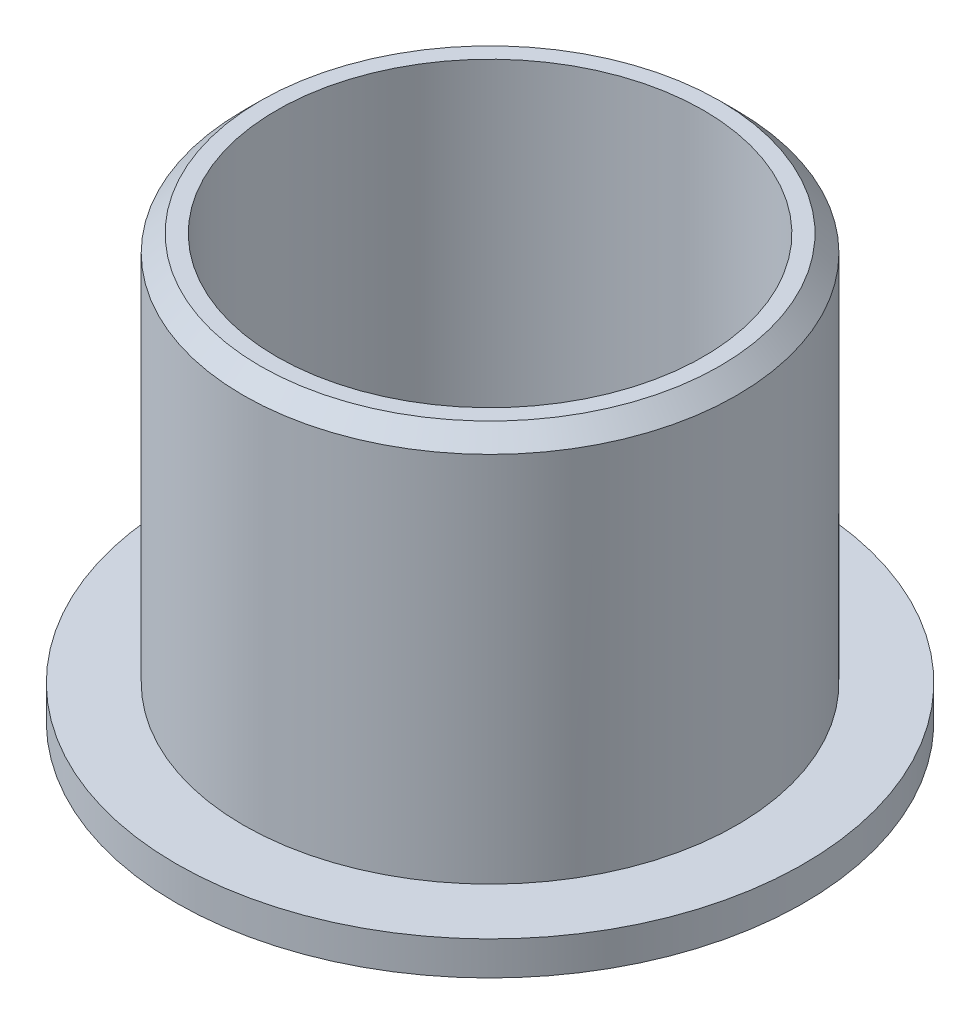
ISO-10303-21;
HEADER;
FILE_DESCRIPTION(('STEP AP214'),'2;1');
FILE_NAME('part.step','',(''),(''),'','','');
FILE_SCHEMA(('AUTOMOTIVE_DESIGN { 1 0 10303 214 1 1 1 1 }'));
ENDSEC;
DATA;
#1=APPLICATION_CONTEXT('core data for automotive mechanical design processes');
#2=APPLICATION_PROTOCOL_DEFINITION('international standard','automotive_design',2000,#1);
#3=PRODUCT_CONTEXT('',#1,'mechanical');
#4=PRODUCT('Part','Part','',(#3));
#5=PRODUCT_RELATED_PRODUCT_CATEGORY('part','',(#4));
#6=PRODUCT_DEFINITION_FORMATION('','',#4);
#7=PRODUCT_DEFINITION_CONTEXT('part definition',#1,'design');
#8=PRODUCT_DEFINITION('design','',#6,#7);
#9=PRODUCT_DEFINITION_SHAPE('','',#8);
#10=(LENGTH_UNIT() NAMED_UNIT(*) SI_UNIT(.MILLI.,.METRE.));
#11=(NAMED_UNIT(*) PLANE_ANGLE_UNIT() SI_UNIT($,.RADIAN.));
#12=(NAMED_UNIT(*) SI_UNIT($,.STERADIAN.) SOLID_ANGLE_UNIT());
#13=UNCERTAINTY_MEASURE_WITH_UNIT(LENGTH_MEASURE(1.E-05),#10,'distance_accuracy_value','');
#14=(GEOMETRIC_REPRESENTATION_CONTEXT(3) GLOBAL_UNCERTAINTY_ASSIGNED_CONTEXT((#13)) GLOBAL_UNIT_ASSIGNED_CONTEXT((#10,
#11,#12)) REPRESENTATION_CONTEXT('',''));
#15=CARTESIAN_POINT('',(0.,0.,0.));
#16=DIRECTION('',(0.,0.,1.));
#17=DIRECTION('',(1.,0.,0.));
#18=AXIS2_PLACEMENT_3D('',#15,#16,#17);
#19=CARTESIAN_POINT('',(0.,0.,0.));
#20=DIRECTION('',(0.,1.,0.));
#21=DIRECTION('',(0.,0.,1.));
#22=AXIS2_PLACEMENT_3D('',#19,#20,#21);
#23=PLANE('',#22);
#24=CARTESIAN_POINT('',(0.,0.,0.));
#25=DIRECTION('',(0.,1.,0.));
#26=DIRECTION('',(0.,0.,1.));
#27=AXIS2_PLACEMENT_3D('',#24,#25,#26);
#28=CIRCLE('',#27,9.6139);
#29=CARTESIAN_POINT('',(0.,0.,9.6139));
#30=VERTEX_POINT('',#29);
#31=EDGE_CURVE('E17',#30,#30,#28,.T.);
#32=ORIENTED_EDGE('',*,*,#31,.T.);
#33=EDGE_LOOP('',(#32));
#34=FACE_BOUND('',#33,.T.);
#35=CARTESIAN_POINT('',(0.,0.,0.));
#36=DIRECTION('',(0.,1.,0.));
#37=DIRECTION('',(0.,0.,1.));
#38=AXIS2_PLACEMENT_3D('',#35,#36,#37);
#39=CIRCLE('',#38,14.1351);
#40=CARTESIAN_POINT('',(0.,0.,14.1351));
#41=VERTEX_POINT('',#40);
#42=EDGE_CURVE('E38',#41,#41,#39,.T.);
#43=ORIENTED_EDGE('',*,*,#42,.F.);
#44=EDGE_LOOP('',(#43));
#45=FACE_BOUND('',#44,.T.);
#46=ADVANCED_FACE('F14',(#34,#45),#23,.F.);
#47=CARTESIAN_POINT('',(0.,0.,0.));
#48=DIRECTION('',(0.,1.,0.));
#49=DIRECTION('',(0.,0.,1.));
#50=AXIS2_PLACEMENT_3D('',#47,#48,#49);
#51=CYLINDRICAL_SURFACE('',#50,9.6139);
#52=CARTESIAN_POINT('',(0.,19.05,0.));
#53=DIRECTION('',(0.,1.,0.));
#54=DIRECTION('',(0.,0.,1.));
#55=AXIS2_PLACEMENT_3D('',#52,#53,#54);
#56=CIRCLE('',#55,9.6139);
#57=CARTESIAN_POINT('',(0.,19.05,9.6139));
#58=VERTEX_POINT('',#57);
#59=EDGE_CURVE('E36',#58,#58,#56,.F.);
#60=ORIENTED_EDGE('',*,*,#59,.F.);
#61=EDGE_LOOP('',(#60));
#62=FACE_BOUND('',#61,.T.);
#63=ORIENTED_EDGE('',*,*,#31,.F.);
#64=EDGE_LOOP('',(#63));
#65=FACE_BOUND('',#64,.T.);
#66=ADVANCED_FACE('F47',(#62,#65),#51,.F.);
#67=CARTESIAN_POINT('',(0.,0.,0.));
#68=DIRECTION('',(0.,1.,0.));
#69=DIRECTION('',(0.,0.,1.));
#70=AXIS2_PLACEMENT_3D('',#67,#68,#69);
#71=CYLINDRICAL_SURFACE('',#70,14.1351);
#72=CARTESIAN_POINT('',(0.,1.524,0.));
#73=DIRECTION('',(0.,1.,0.));
#74=DIRECTION('',(0.,0.,1.));
#75=AXIS2_PLACEMENT_3D('',#72,#73,#74);
#76=CIRCLE('',#75,14.1351);
#77=CARTESIAN_POINT('',(0.,1.524,14.1351));
#78=VERTEX_POINT('',#77);
#79=EDGE_CURVE('E33',#78,#78,#76,.T.);
#80=ORIENTED_EDGE('',*,*,#79,.F.);
#81=EDGE_LOOP('',(#80));
#82=FACE_BOUND('',#81,.T.);
#83=ORIENTED_EDGE('',*,*,#42,.T.);
#84=EDGE_LOOP('',(#83));
#85=FACE_BOUND('',#84,.T.);
#86=ADVANCED_FACE('F49',(#82,#85),#71,.T.);
#87=CARTESIAN_POINT('',(0.,19.05,0.));
#88=DIRECTION('',(0.,1.,0.));
#89=DIRECTION('',(0.,0.,1.));
#90=AXIS2_PLACEMENT_3D('',#87,#88,#89);
#91=PLANE('',#90);
#92=ORIENTED_EDGE('',*,*,#59,.T.);
#93=EDGE_LOOP('',(#92));
#94=FACE_BOUND('',#93,.T.);
#95=CARTESIAN_POINT('',(0.,19.0500008976633,0.));
#96=DIRECTION('',(0.,-1.,0.));
#97=DIRECTION('',(0.,0.,-1.));
#98=AXIS2_PLACEMENT_3D('',#95,#96,#97);
#99=CIRCLE('',#98,10.3504996253696);
#100=CARTESIAN_POINT('',(0.,19.0500008976633,-10.3504996253696));
#101=VERTEX_POINT('',#100);
#102=EDGE_CURVE('E26',#101,#101,#99,.T.);
#103=ORIENTED_EDGE('',*,*,#102,.F.);
#104=EDGE_LOOP('',(#103));
#105=FACE_BOUND('',#104,.T.);
#106=ADVANCED_FACE('F56',(#94,#105),#91,.T.);
#107=CARTESIAN_POINT('',(0.,1.524,0.));
#108=DIRECTION('',(0.,1.,0.));
#109=DIRECTION('',(0.,0.,1.));
#110=AXIS2_PLACEMENT_3D('',#107,#108,#109);
#111=PLANE('',#110);
#112=CARTESIAN_POINT('',(0.,1.524,0.));
#113=DIRECTION('',(0.,1.,0.));
#114=DIRECTION('',(0.,0.,1.));
#115=AXIS2_PLACEMENT_3D('',#112,#113,#114);
#116=CIRCLE('',#115,11.1125);
#117=CARTESIAN_POINT('',(0.,1.524,11.1125));
#118=VERTEX_POINT('',#117);
#119=EDGE_CURVE('E21',#118,#118,#116,.T.);
#120=ORIENTED_EDGE('',*,*,#119,.F.);
#121=EDGE_LOOP('',(#120));
#122=FACE_BOUND('',#121,.T.);
#123=ORIENTED_EDGE('',*,*,#79,.T.);
#124=EDGE_LOOP('',(#123));
#125=FACE_BOUND('',#124,.T.);
#126=ADVANCED_FACE('F67',(#122,#125),#111,.T.);
#127=CARTESIAN_POINT('',(0.,18.2879995939843,0.));
#128=DIRECTION('',(0.,-1.,0.));
#129=DIRECTION('',(0.,0.,-1.));
#130=AXIS2_PLACEMENT_3D('',#127,#128,#129);
#131=CONICAL_SURFACE('',#130,11.1125009641974,0.785398186460953);
#132=CARTESIAN_POINT('',(0.,18.2879986297868,0.));
#133=DIRECTION('',(0.,1.,0.));
#134=DIRECTION('',(0.,0.,1.));
#135=AXIS2_PLACEMENT_3D('',#132,#133,#134);
#136=CIRCLE('',#135,11.1125);
#137=CARTESIAN_POINT('',(0.,18.2879986297868,11.1125));
#138=VERTEX_POINT('',#137);
#139=EDGE_CURVE('E9',#138,#138,#136,.F.);
#140=ORIENTED_EDGE('',*,*,#139,.F.);
#141=EDGE_LOOP('',(#140));
#142=FACE_BOUND('',#141,.T.);
#143=ORIENTED_EDGE('',*,*,#102,.T.);
#144=EDGE_LOOP('',(#143));
#145=FACE_BOUND('',#144,.T.);
#146=ADVANCED_FACE('F62',(#142,#145),#131,.T.);
#147=CARTESIAN_POINT('',(0.,19.05,0.));
#148=DIRECTION('',(0.,1.,0.));
#149=DIRECTION('',(0.,0.,1.));
#150=AXIS2_PLACEMENT_3D('',#147,#148,#149);
#151=CYLINDRICAL_SURFACE('',#150,11.1125);
#152=ORIENTED_EDGE('',*,*,#139,.T.);
#153=EDGE_LOOP('',(#152));
#154=FACE_BOUND('',#153,.T.);
#155=ORIENTED_EDGE('',*,*,#119,.T.);
#156=EDGE_LOOP('',(#155));
#157=FACE_BOUND('',#156,.T.);
#158=ADVANCED_FACE('F60',(#154,#157),#151,.T.);
#159=CLOSED_SHELL('',(#46,#66,#86,#106,#126,#146,#158));
#160=MANIFOLD_SOLID_BREP('B1',#159);
#161=ADVANCED_BREP_SHAPE_REPRESENTATION('',(#18,#160),#14);
#162=SHAPE_DEFINITION_REPRESENTATION(#9,#161);
ENDSEC;
END-ISO-10303-21;
